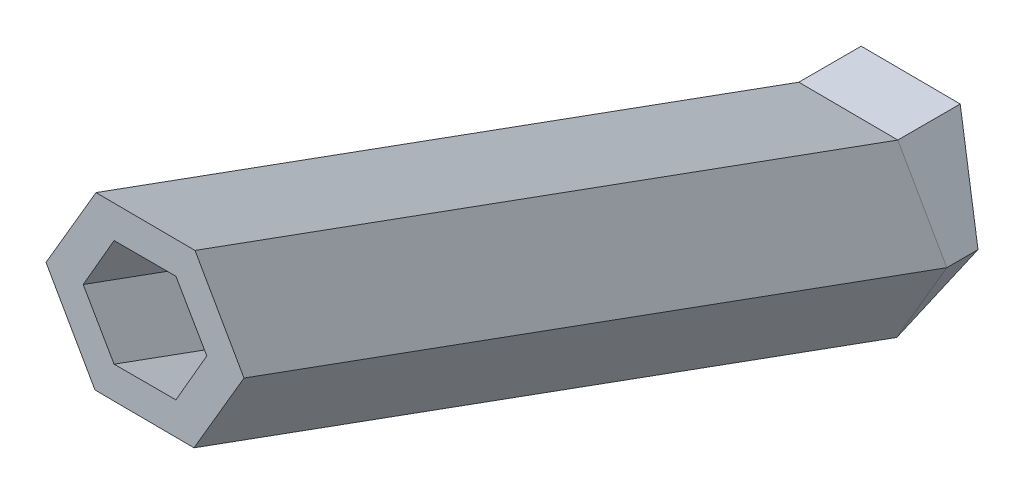
ISO-10303-21;
HEADER;
FILE_DESCRIPTION(('STEP AP214'),'2;1');
FILE_NAME('part.step','',(''),(''),'','','');
FILE_SCHEMA(('AUTOMOTIVE_DESIGN { 1 0 10303 214 1 1 1 1 }'));
ENDSEC;
DATA;
#1=APPLICATION_CONTEXT('core data for automotive mechanical design processes');
#2=APPLICATION_PROTOCOL_DEFINITION('international standard','automotive_design',2000,#1);
#3=PRODUCT_CONTEXT('',#1,'mechanical');
#4=PRODUCT('Part','Part','',(#3));
#5=PRODUCT_RELATED_PRODUCT_CATEGORY('part','',(#4));
#6=PRODUCT_DEFINITION_FORMATION('','',#4);
#7=PRODUCT_DEFINITION_CONTEXT('part definition',#1,'design');
#8=PRODUCT_DEFINITION('design','',#6,#7);
#9=PRODUCT_DEFINITION_SHAPE('','',#8);
#10=(LENGTH_UNIT() NAMED_UNIT(*) SI_UNIT(.MILLI.,.METRE.));
#11=(NAMED_UNIT(*) PLANE_ANGLE_UNIT() SI_UNIT($,.RADIAN.));
#12=(NAMED_UNIT(*) SI_UNIT($,.STERADIAN.) SOLID_ANGLE_UNIT());
#13=UNCERTAINTY_MEASURE_WITH_UNIT(LENGTH_MEASURE(1.E-05),#10,'distance_accuracy_value','');
#14=(GEOMETRIC_REPRESENTATION_CONTEXT(3) GLOBAL_UNCERTAINTY_ASSIGNED_CONTEXT((#13)) GLOBAL_UNIT_ASSIGNED_CONTEXT((#10,
#11,#12)) REPRESENTATION_CONTEXT('',''));
#15=CARTESIAN_POINT('',(0.,0.,0.));
#16=DIRECTION('',(0.,0.,1.));
#17=DIRECTION('',(1.,0.,0.));
#18=AXIS2_PLACEMENT_3D('',#15,#16,#17);
#19=CARTESIAN_POINT('',(0.128355163343738,1.38763360146466E-13,6.20198748145939));
#20=DIRECTION('',(0.,0.,1.));
#21=DIRECTION('',(1.,0.,0.));
#22=AXIS2_PLACEMENT_3D('',#19,#20,#21);
#23=PLANE('',#22);
#24=DIRECTION('',(1.,0.,0.));
#25=VECTOR('',#24,1.);
#26=CARTESIAN_POINT('',(3.64119484408319,-6.08441680588479,6.20198748145939));
#27=LINE('',#26,#25);
#28=CARTESIAN_POINT('',(-3.38448451739586,-6.0844168058847,6.20198748145939));
#29=VERTEX_POINT('',#28);
#30=CARTESIAN_POINT('',(3.64119484408319,-6.08441680588479,6.20198748145939));
#31=VERTEX_POINT('',#30);
#32=EDGE_CURVE('E299',#29,#31,#27,.T.);
#33=ORIENTED_EDGE('',*,*,#32,.T.);
#34=DIRECTION('',(0.500000000000011,0.866025403784432,0.));
#35=VECTOR('',#34,1.);
#36=CARTESIAN_POINT('',(6.99580116644336,-0.274068216165352,6.20198748145939));
#37=LINE('',#36,#35);
#38=CARTESIAN_POINT('',(7.15403452482278,0.,6.20198748145939));
#39=VERTEX_POINT('',#38);
#40=EDGE_CURVE('E294',#31,#39,#37,.T.);
#41=ORIENTED_EDGE('',*,*,#40,.T.);
#42=DIRECTION('',(-0.499999999999989,0.866025403784445,0.));
#43=VECTOR('',#42,1.);
#44=CARTESIAN_POINT('',(3.79942820246275,5.81034858971957,6.20198748145939));
#45=LINE('',#44,#43);
#46=CARTESIAN_POINT('',(3.64119484408333,6.08441680588498,6.20198748145939));
#47=VERTEX_POINT('',#46);
#48=EDGE_CURVE('E288',#39,#47,#45,.T.);
#49=ORIENTED_EDGE('',*,*,#48,.T.);
#50=DIRECTION('',(-1.,0.,0.));
#51=VECTOR('',#50,1.);
#52=CARTESIAN_POINT('',(-3.3844845173957,6.08441680588507,6.20198748145939));
#53=LINE('',#52,#51);
#54=CARTESIAN_POINT('',(-3.38448451739571,6.08441680588506,6.20198748145937));
#55=VERTEX_POINT('',#54);
#56=EDGE_CURVE('E275',#47,#55,#53,.T.);
#57=ORIENTED_EDGE('',*,*,#56,.T.);
#58=DIRECTION('',(-0.500000000000011,-0.866025403784432,0.));
#59=VECTOR('',#58,1.);
#60=CARTESIAN_POINT('',(-7.05555755651473,-0.274068216165179,6.20198748145939));
#61=LINE('',#60,#59);
#62=CARTESIAN_POINT('',(-6.8973241981353,2.25011642967688E-13,6.20198748145939));
#63=VERTEX_POINT('',#62);
#64=EDGE_CURVE('E309',#55,#63,#61,.T.);
#65=ORIENTED_EDGE('',*,*,#64,.T.);
#66=DIRECTION('',(0.499999999999989,-0.866025403784445,0.));
#67=VECTOR('',#66,1.);
#68=CARTESIAN_POINT('',(-3.22625115901644,-6.35848502205012,6.20198748145939));
#69=LINE('',#68,#67);
#70=EDGE_CURVE('E304',#63,#29,#69,.T.);
#71=ORIENTED_EDGE('',*,*,#70,.T.);
#72=EDGE_LOOP('',(#33,#41,#49,#57,#65,#71));
#73=FACE_BOUND('',#72,.T.);
#74=DIRECTION('',(-0.999982083015537,0.00598612127412032,0.));
#75=VECTOR('',#74,1.);
#76=CARTESIAN_POINT('',(5.812623598539,9.71072917481305,6.20198748145939));
#77=LINE('',#76,#75);
#78=CARTESIAN_POINT('',(5.812623598539,9.71072917481305,6.20198748145939));
#79=VERTEX_POINT('',#78);
#80=CARTESIAN_POINT('',(-5.43924877371731,9.77808545421571,6.20198748145939));
#81=VERTEX_POINT('',#80);
#82=EDGE_CURVE('E317',#79,#81,#77,.T.);
#83=ORIENTED_EDGE('',*,*,#82,.F.);
#84=DIRECTION('',(-0.494806908414245,0.869002947857795,0.));
#85=VECTOR('',#84,1.);
#86=CARTESIAN_POINT('',(11.3802275356,-0.0673562794025248,6.20198748145939));
#87=LINE('',#86,#85);
#88=CARTESIAN_POINT('',(11.3802275356,-0.0673562794025248,6.20198748145939));
#89=VERTEX_POINT('',#88);
#90=EDGE_CURVE('E366',#89,#79,#87,.T.);
#91=ORIENTED_EDGE('',*,*,#90,.F.);
#92=DIRECTION('',(0.505175174601291,0.863016826583674,0.));
#93=VECTOR('',#92,1.);
#94=CARTESIAN_POINT('',(5.69595910040478,-9.77808545421543,6.20198748145939));
#95=LINE('',#94,#93);
#96=CARTESIAN_POINT('',(5.69595910040478,-9.77808545421543,6.20198748145939));
#97=VERTEX_POINT('',#96);
#98=EDGE_CURVE('E392',#97,#89,#95,.T.);
#99=ORIENTED_EDGE('',*,*,#98,.F.);
#100=DIRECTION('',(0.999982083015537,-0.00598612127412063,0.));
#101=VECTOR('',#100,1.);
#102=CARTESIAN_POINT('',(-5.55591327185152,-9.71072917481277,6.20198748145939));
#103=LINE('',#102,#101);
#104=CARTESIAN_POINT('',(-5.55591327185152,-9.71072917481277,6.20198748145939));
#105=VERTEX_POINT('',#104);
#106=EDGE_CURVE('E381',#105,#97,#103,.T.);
#107=ORIENTED_EDGE('',*,*,#106,.F.);
#108=DIRECTION('',(0.494806908414245,-0.869002947857794,0.));
#109=VECTOR('',#108,1.);
#110=CARTESIAN_POINT('',(-11.1235172089126,0.0673562794028021,6.20198748145939));
#111=LINE('',#110,#109);
#112=CARTESIAN_POINT('',(-11.1235172089126,0.0673562794028021,6.20198748145939));
#113=VERTEX_POINT('',#112);
#114=EDGE_CURVE('E370',#113,#105,#111,.T.);
#115=ORIENTED_EDGE('',*,*,#114,.F.);
#116=DIRECTION('',(-0.50517517460129,-0.863016826583674,0.));
#117=VECTOR('',#116,1.);
#118=CARTESIAN_POINT('',(-5.43924877371731,9.77808545421571,6.20198748145939));
#119=LINE('',#118,#117);
#120=EDGE_CURVE('E353',#81,#113,#119,.T.);
#121=ORIENTED_EDGE('',*,*,#120,.F.);
#122=EDGE_LOOP('',(#83,#91,#99,#107,#115,#121));
#123=FACE_BOUND('',#122,.T.);
#124=ADVANCED_FACE('F55',(#73,#123),#23,.F.);
#125=CARTESIAN_POINT('',(0.128355163343738,29.0717121826812,86.0758602482619));
#126=DIRECTION('',(0.,0.,1.));
#127=DIRECTION('',(1.,0.,0.));
#128=AXIS2_PLACEMENT_3D('',#125,#126,#127);
#129=PLANE('',#128);
#130=DIRECTION('',(-0.499999999999989,0.866025403784445,0.));
#131=VECTOR('',#130,1.);
#132=CARTESIAN_POINT('',(16.3878488433183,13.0782766353895,86.0758602482619));
#133=LINE('',#132,#131);
#134=CARTESIAN_POINT('',(7.15403452482278,29.0717121826812,86.0758602482619));
#135=VERTEX_POINT('',#134);
#136=CARTESIAN_POINT('',(3.64119484408333,35.1561289885661,86.0758602482619));
#137=VERTEX_POINT('',#136);
#138=EDGE_CURVE('E333',#135,#137,#133,.T.);
#139=ORIENTED_EDGE('',*,*,#138,.F.);
#140=DIRECTION('',(0.500000000000011,0.866025403784432,0.));
#141=VECTOR('',#140,1.);
#142=CARTESIAN_POINT('',(-5.59261947441254,6.99385982950525,86.0758602482619));
#143=LINE('',#142,#141);
#144=CARTESIAN_POINT('',(3.64119484408319,22.9872953767964,86.0758602482619));
#145=VERTEX_POINT('',#144);
#146=EDGE_CURVE('E313',#145,#135,#143,.T.);
#147=ORIENTED_EDGE('',*,*,#146,.F.);
#148=DIRECTION('',(1.,0.,0.));
#149=VECTOR('',#148,1.);
#150=CARTESIAN_POINT('',(3.64119484408355,22.9872953767964,86.0758602482619));
#151=LINE('',#150,#149);
#152=CARTESIAN_POINT('',(-3.38448451739586,22.9872953767964,86.0758602482619));
#153=VERTEX_POINT('',#152);
#154=EDGE_CURVE('E318',#153,#145,#151,.T.);
#155=ORIENTED_EDGE('',*,*,#154,.F.);
#156=DIRECTION('',(0.499999999999989,-0.866025403784445,0.));
#157=VECTOR('',#156,1.);
#158=CARTESIAN_POINT('',(9.36216948183909,0.909443023619861,86.0758602482619));
#159=LINE('',#158,#157);
#160=CARTESIAN_POINT('',(-6.8973241981353,29.0717121826814,86.0758602482619));
#161=VERTEX_POINT('',#160);
#162=EDGE_CURVE('E321',#161,#153,#159,.T.);
#163=ORIENTED_EDGE('',*,*,#162,.F.);
#164=DIRECTION('',(-0.500000000000011,-0.866025403784432,0.));
#165=VECTOR('',#164,1.);
#166=CARTESIAN_POINT('',(-19.6439781973706,6.99385982950542,86.0758602482619));
#167=LINE('',#166,#165);
#168=CARTESIAN_POINT('',(-3.38448451739571,35.1561289885662,86.0758602482619));
#169=VERTEX_POINT('',#168);
#170=EDGE_CURVE('E325',#169,#161,#167,.T.);
#171=ORIENTED_EDGE('',*,*,#170,.F.);
#172=DIRECTION('',(-1.,0.,0.));
#173=VECTOR('',#172,1.);
#174=CARTESIAN_POINT('',(-3.38448451739535,35.1561289885662,86.0758602482619));
#175=LINE('',#174,#173);
#176=EDGE_CURVE('E329',#137,#169,#175,.T.);
#177=ORIENTED_EDGE('',*,*,#176,.F.);
#178=EDGE_LOOP('',(#139,#147,#155,#163,#171,#177));
#179=FACE_BOUND('',#178,.T.);
#180=DIRECTION('',(-0.999982083015537,0.00598612127412032,0.));
#181=VECTOR('',#180,1.);
#182=CARTESIAN_POINT('',(5.812623598539,38.7824413574941,86.0758602482619));
#183=LINE('',#182,#181);
#184=CARTESIAN_POINT('',(5.812623598539,38.7824413574941,86.0758602482619));
#185=VERTEX_POINT('',#184);
#186=CARTESIAN_POINT('',(-5.43924877371731,38.8497976368968,86.0758602482619));
#187=VERTEX_POINT('',#186);
#188=EDGE_CURVE('E354',#185,#187,#183,.T.);
#189=ORIENTED_EDGE('',*,*,#188,.T.);
#190=DIRECTION('',(-0.50517517460129,-0.863016826583674,0.));
#191=VECTOR('',#190,1.);
#192=CARTESIAN_POINT('',(-5.43924877371731,38.8497976368968,86.0758602482619));
#193=LINE('',#192,#191);
#194=CARTESIAN_POINT('',(-11.1235172089126,29.1390684620839,86.0758602482619));
#195=VERTEX_POINT('',#194);
#196=EDGE_CURVE('E362',#187,#195,#193,.T.);
#197=ORIENTED_EDGE('',*,*,#196,.T.);
#198=DIRECTION('',(0.494806908414245,-0.869002947857794,0.));
#199=VECTOR('',#198,1.);
#200=CARTESIAN_POINT('',(-11.1235172089126,29.1390684620839,86.0758602482619));
#201=LINE('',#200,#199);
#202=CARTESIAN_POINT('',(-5.55591327185152,19.3609830078683,86.0758602482619));
#203=VERTEX_POINT('',#202);
#204=EDGE_CURVE('E377',#195,#203,#201,.T.);
#205=ORIENTED_EDGE('',*,*,#204,.T.);
#206=DIRECTION('',(0.999982083015537,-0.00598612127412063,0.));
#207=VECTOR('',#206,1.);
#208=CARTESIAN_POINT('',(-5.55591327185152,19.3609830078683,86.0758602482619));
#209=LINE('',#208,#207);
#210=CARTESIAN_POINT('',(5.69595910040478,19.2936267284657,86.0758602482619));
#211=VERTEX_POINT('',#210);
#212=EDGE_CURVE('E388',#203,#211,#209,.T.);
#213=ORIENTED_EDGE('',*,*,#212,.T.);
#214=DIRECTION('',(0.505175174601291,0.863016826583674,0.));
#215=VECTOR('',#214,1.);
#216=CARTESIAN_POINT('',(5.69595910040478,19.2936267284657,86.0758602482619));
#217=LINE('',#216,#215);
#218=CARTESIAN_POINT('',(11.3802275356,29.0043559032786,86.0758602482619));
#219=VERTEX_POINT('',#218);
#220=EDGE_CURVE('E399',#211,#219,#217,.T.);
#221=ORIENTED_EDGE('',*,*,#220,.T.);
#222=DIRECTION('',(-0.494806908414245,0.869002947857795,0.));
#223=VECTOR('',#222,1.);
#224=CARTESIAN_POINT('',(11.3802275356,29.0043559032786,86.0758602482619));
#225=LINE('',#224,#223);
#226=EDGE_CURVE('E12',#219,#185,#225,.T.);
#227=ORIENTED_EDGE('',*,*,#226,.T.);
#228=EDGE_LOOP('',(#189,#197,#205,#213,#221,#227));
#229=FACE_BOUND('',#228,.T.);
#230=ADVANCED_FACE('F421',(#179,#229),#129,.T.);
#231=CARTESIAN_POINT('',(5.812623598539,9.71072917481305,6.20198748145939));
#232=DIRECTION('',(0.00562512577796662,0.939677753772549,-0.342014732175324));
#233=DIRECTION('',(0.,0.34202014332566,0.939692620785912));
#234=AXIS2_PLACEMENT_3D('',#231,#232,#233);
#235=PLANE('',#234);
#236=DIRECTION('',(0.,0.34202014332566,0.939692620785912));
#237=VECTOR('',#236,1.);
#238=CARTESIAN_POINT('',(-5.43924877371731,9.77808545421571,6.20198748145939));
#239=LINE('',#238,#237);
#240=EDGE_CURVE('E357',#81,#187,#239,.T.);
#241=ORIENTED_EDGE('',*,*,#240,.T.);
#242=ORIENTED_EDGE('',*,*,#188,.F.);
#243=DIRECTION('',(0.,0.34202014332566,0.939692620785912));
#244=VECTOR('',#243,1.);
#245=CARTESIAN_POINT('',(5.812623598539,9.71072917481305,6.20198748145939));
#246=LINE('',#245,#244);
#247=EDGE_CURVE('E358',#79,#185,#246,.T.);
#248=ORIENTED_EDGE('',*,*,#247,.F.);
#249=ORIENTED_EDGE('',*,*,#82,.T.);
#250=EDGE_LOOP('',(#241,#242,#248,#249));
#251=FACE_BOUND('',#250,.T.);
#252=ADVANCED_FACE('F417',(#251),#235,.T.);
#253=CARTESIAN_POINT('',(-5.43924877371731,9.77808545421571,6.20198748145939));
#254=DIRECTION('',(-0.848788291898737,0.496846365391118,-0.180837288005711));
#255=DIRECTION('',(-0.50517517460129,-0.863016826583675,0.));
#256=AXIS2_PLACEMENT_3D('',#253,#254,#255);
#257=PLANE('',#256);
#258=DIRECTION('',(0.,0.34202014332566,0.939692620785912));
#259=VECTOR('',#258,1.);
#260=CARTESIAN_POINT('',(-11.1235172089126,0.0673562794028021,6.20198748145939));
#261=LINE('',#260,#259);
#262=EDGE_CURVE('E373',#113,#195,#261,.T.);
#263=ORIENTED_EDGE('',*,*,#262,.T.);
#264=ORIENTED_EDGE('',*,*,#196,.F.);
#265=ORIENTED_EDGE('',*,*,#240,.F.);
#266=ORIENTED_EDGE('',*,*,#120,.T.);
#267=EDGE_LOOP('',(#263,#264,#265,#266));
#268=FACE_BOUND('',#267,.T.);
#269=ADVANCED_FACE('F424',(#268),#257,.T.);
#270=CARTESIAN_POINT('',(-11.1235172089126,0.0673562794028021,6.20198748145939));
#271=DIRECTION('',(-0.855244042473658,-0.486972641047177,0.177243546243167));
#272=DIRECTION('',(0.494806908414245,-0.869002947857794,0.));
#273=AXIS2_PLACEMENT_3D('',#270,#271,#272);
#274=PLANE('',#273);
#275=DIRECTION('',(0.,0.34202014332566,0.939692620785912));
#276=VECTOR('',#275,1.);
#277=CARTESIAN_POINT('',(-5.55591327185152,-9.71072917481277,6.20198748145939));
#278=LINE('',#277,#276);
#279=EDGE_CURVE('E384',#105,#203,#278,.T.);
#280=ORIENTED_EDGE('',*,*,#279,.T.);
#281=ORIENTED_EDGE('',*,*,#204,.F.);
#282=ORIENTED_EDGE('',*,*,#262,.F.);
#283=ORIENTED_EDGE('',*,*,#114,.T.);
#284=EDGE_LOOP('',(#280,#281,#282,#283));
#285=FACE_BOUND('',#284,.T.);
#286=ADVANCED_FACE('F427',(#285),#274,.T.);
#287=CARTESIAN_POINT('',(-5.55591327185152,-9.71072917481277,6.20198748145939));
#288=DIRECTION('',(-0.00562512577796692,-0.939677753772549,0.342014732175324));
#289=DIRECTION('',(0.,-0.34202014332566,-0.939692620785912));
#290=AXIS2_PLACEMENT_3D('',#287,#288,#289);
#291=PLANE('',#290);
#292=DIRECTION('',(0.,-0.34202014332566,-0.939692620785911));
#293=VECTOR('',#292,1.);
#294=CARTESIAN_POINT('',(-3.67991775642901,-4.59277851637198,20.2942958996383));
#295=LINE('',#294,#293);
#296=CARTESIAN_POINT('',(-3.67991775642901,-2.02762744142953,27.3419905555327));
#297=VERTEX_POINT('',#296);
#298=CARTESIAN_POINT('',(-3.67991775642901,-4.59277851637198,20.2942958996383));
#299=VERTEX_POINT('',#298);
#300=EDGE_CURVE('E70',#297,#299,#295,.T.);
#301=ORIENTED_EDGE('',*,*,#300,.F.);
#302=DIRECTION('',(-0.999984178854837,0.00528588918454823,-0.00192390632480545));
#303=VECTOR('',#302,1.);
#304=CARTESIAN_POINT('',(3.81996358498227,-2.06727161031364,27.3564198529687));
#305=LINE('',#304,#303);
#306=CARTESIAN_POINT('',(3.81996358498227,-2.06727161031364,27.3564198529687));
#307=VERTEX_POINT('',#306);
#308=EDGE_CURVE('E214',#307,#297,#305,.T.);
#309=ORIENTED_EDGE('',*,*,#308,.F.);
#310=DIRECTION('',(0.,0.34202014332566,0.939692620785911));
#311=VECTOR('',#310,1.);
#312=CARTESIAN_POINT('',(3.81996358498227,-4.63242268525609,20.3087251970744));
#313=LINE('',#312,#311);
#314=CARTESIAN_POINT('',(3.81996358498227,-4.63242268525609,20.3087251970744));
#315=VERTEX_POINT('',#314);
#316=EDGE_CURVE('E218',#315,#307,#313,.T.);
#317=ORIENTED_EDGE('',*,*,#316,.F.);
#318=DIRECTION('',(0.999984178854837,-0.00528588918454811,0.00192390632480545));
#319=VECTOR('',#318,1.);
#320=CARTESIAN_POINT('',(3.81996358498227,-4.63242268525609,20.3087251970744));
#321=LINE('',#320,#319);
#322=EDGE_CURVE('E227',#299,#315,#321,.T.);
#323=ORIENTED_EDGE('',*,*,#322,.F.);
#324=EDGE_LOOP('',(#301,#309,#317,#323));
#325=FACE_BOUND('',#324,.T.);
#326=DIRECTION('',(0.,0.34202014332566,0.939692620785912));
#327=VECTOR('',#326,1.);
#328=CARTESIAN_POINT('',(3.81996358498227,14.1753149404144,71.9825596346326));
#329=LINE('',#328,#327);
#330=CARTESIAN_POINT('',(3.81996358498227,11.6101638654719,64.9348649787382));
#331=VERTEX_POINT('',#330);
#332=CARTESIAN_POINT('',(3.81996358498116,14.1753149404144,71.9825596346326));
#333=VERTEX_POINT('',#332);
#334=EDGE_CURVE('E78',#331,#333,#329,.T.);
#335=ORIENTED_EDGE('',*,*,#334,.F.);
#336=DIRECTION('',(0.999984178854837,-0.00528588918454799,0.00192390632480407));
#337=VECTOR('',#336,1.);
#338=CARTESIAN_POINT('',(-3.679917756429,11.649808034356,64.9204356813022));
#339=LINE('',#338,#337);
#340=CARTESIAN_POINT('',(-3.679917756429,11.649808034356,64.9204356813022));
#341=VERTEX_POINT('',#340);
#342=EDGE_CURVE('E246',#341,#331,#339,.T.);
#343=ORIENTED_EDGE('',*,*,#342,.F.);
#344=DIRECTION('',(0.,-0.34202014332566,-0.939692620785912));
#345=VECTOR('',#344,1.);
#346=CARTESIAN_POINT('',(-3.679917756429,14.2149591092985,71.9681303371965));
#347=LINE('',#346,#345);
#348=CARTESIAN_POINT('',(-3.679917756429,14.2149591092985,71.9681303371965));
#349=VERTEX_POINT('',#348);
#350=EDGE_CURVE('E265',#349,#341,#347,.T.);
#351=ORIENTED_EDGE('',*,*,#350,.F.);
#352=DIRECTION('',(-0.999984178854837,0.00528588918454799,-0.00192390632480407));
#353=VECTOR('',#352,1.);
#354=CARTESIAN_POINT('',(-3.679917756429,14.2149591092985,71.9681303371965));
#355=LINE('',#354,#353);
#356=EDGE_CURVE('E261',#333,#349,#355,.T.);
#357=ORIENTED_EDGE('',*,*,#356,.F.);
#358=EDGE_LOOP('',(#335,#343,#351,#357));
#359=FACE_BOUND('',#358,.T.);
#360=DIRECTION('',(0.,0.34202014332566,0.939692620785912));
#361=VECTOR('',#360,1.);
#362=CARTESIAN_POINT('',(5.69595910040478,-9.77808545421543,6.20198748145939));
#363=LINE('',#362,#361);
#364=EDGE_CURVE('E395',#97,#211,#363,.T.);
#365=ORIENTED_EDGE('',*,*,#364,.T.);
#366=ORIENTED_EDGE('',*,*,#212,.F.);
#367=ORIENTED_EDGE('',*,*,#279,.F.);
#368=ORIENTED_EDGE('',*,*,#106,.T.);
#369=EDGE_LOOP('',(#365,#366,#367,#368));
#370=FACE_BOUND('',#369,.T.);
#371=ADVANCED_FACE('F432',(#325,#359,#370),#291,.T.);
#372=CARTESIAN_POINT('',(5.69595910040478,-9.77808545421543,6.20198748145939));
#373=DIRECTION('',(0.848788291898736,-0.496846365391119,0.180837288005711));
#374=DIRECTION('',(0.505175174601291,0.863016826583674,0.));
#375=AXIS2_PLACEMENT_3D('',#372,#373,#374);
#376=PLANE('',#375);
#377=DIRECTION('',(0.,0.34202014332566,0.939692620785912));
#378=VECTOR('',#377,1.);
#379=CARTESIAN_POINT('',(11.3802275356,-0.0673562794025248,6.20198748145939));
#380=LINE('',#379,#378);
#381=EDGE_CURVE('E63',#89,#219,#380,.T.);
#382=ORIENTED_EDGE('',*,*,#381,.T.);
#383=ORIENTED_EDGE('',*,*,#220,.F.);
#384=ORIENTED_EDGE('',*,*,#364,.F.);
#385=ORIENTED_EDGE('',*,*,#98,.T.);
#386=EDGE_LOOP('',(#382,#383,#384,#385));
#387=FACE_BOUND('',#386,.T.);
#388=ADVANCED_FACE('F435',(#387),#376,.T.);
#389=CARTESIAN_POINT('',(11.3802275356,-0.0673562794025248,6.20198748145939));
#390=DIRECTION('',(0.855244042473658,0.486972641047176,-0.177243546243167));
#391=DIRECTION('',(-0.494806908414245,0.869002947857795,0.));
#392=AXIS2_PLACEMENT_3D('',#389,#390,#391);
#393=PLANE('',#392);
#394=ORIENTED_EDGE('',*,*,#226,.F.);
#395=ORIENTED_EDGE('',*,*,#381,.F.);
#396=ORIENTED_EDGE('',*,*,#90,.T.);
#397=ORIENTED_EDGE('',*,*,#247,.T.);
#398=EDGE_LOOP('',(#394,#395,#396,#397));
#399=FACE_BOUND('',#398,.T.);
#400=ADVANCED_FACE('F413',(#399),#393,.T.);
#401=CARTESIAN_POINT('',(-3.38448451739571,5.71899251766452,5.19799250105314));
#402=DIRECTION('',(0.,-0.939692620785911,0.34202014332566));
#403=DIRECTION('',(0.,-0.342020143325661,-0.939692620785912));
#404=AXIS2_PLACEMENT_3D('',#401,#402,#403);
#405=PLANE('',#404);
#406=ORIENTED_EDGE('',*,*,#176,.T.);
#407=DIRECTION('',(0.,0.34202014332566,0.939692620785911));
#408=VECTOR('',#407,1.);
#409=CARTESIAN_POINT('',(-3.38448451739571,5.71899251766452,5.19799250105314));
#410=LINE('',#409,#408);
#411=EDGE_CURVE('E287',#55,#169,#410,.T.);
#412=ORIENTED_EDGE('',*,*,#411,.F.);
#413=ORIENTED_EDGE('',*,*,#56,.F.);
#414=DIRECTION('',(0.,0.34202014332566,0.939692620785911));
#415=VECTOR('',#414,1.);
#416=CARTESIAN_POINT('',(3.64119484408333,5.71899251766444,5.19799250105314));
#417=LINE('',#416,#415);
#418=EDGE_CURVE('E292',#47,#137,#417,.T.);
#419=ORIENTED_EDGE('',*,*,#418,.T.);
#420=EDGE_LOOP('',(#406,#412,#413,#419));
#421=FACE_BOUND('',#420,.T.);
#422=ADVANCED_FACE('F438',(#421),#405,.T.);
#423=CARTESIAN_POINT('',(-6.8973241981353,-0.365424288220318,5.19799250105314));
#424=DIRECTION('',(0.852031291837936,-0.491920495700631,0.1790444180605));
#425=DIRECTION('',(0.500000000000011,0.866025403784432,0.));
#426=AXIS2_PLACEMENT_3D('',#423,#424,#425);
#427=PLANE('',#426);
#428=ORIENTED_EDGE('',*,*,#170,.T.);
#429=DIRECTION('',(0.,0.34202014332566,0.939692620785911));
#430=VECTOR('',#429,1.);
#431=CARTESIAN_POINT('',(-6.8973241981353,-0.365424288220318,5.19799250105314));
#432=LINE('',#431,#430);
#433=EDGE_CURVE('E308',#63,#161,#432,.T.);
#434=ORIENTED_EDGE('',*,*,#433,.F.);
#435=ORIENTED_EDGE('',*,*,#64,.F.);
#436=ORIENTED_EDGE('',*,*,#411,.T.);
#437=EDGE_LOOP('',(#428,#434,#435,#436));
#438=FACE_BOUND('',#437,.T.);
#439=ADVANCED_FACE('F445',(#438),#427,.T.);
#440=CARTESIAN_POINT('',(-3.38448451739586,-6.44984109410525,5.19799250105314));
#441=DIRECTION('',(0.852031291837949,0.491920495700611,-0.179044418060493));
#442=DIRECTION('',(-0.499999999999989,0.866025403784445,0.));
#443=AXIS2_PLACEMENT_3D('',#440,#441,#442);
#444=PLANE('',#443);
#445=ORIENTED_EDGE('',*,*,#162,.T.);
#446=DIRECTION('',(0.,0.34202014332566,0.939692620785911));
#447=VECTOR('',#446,1.);
#448=CARTESIAN_POINT('',(-3.38448451739586,-6.44984109410525,5.19799250105314));
#449=LINE('',#448,#447);
#450=EDGE_CURVE('E303',#29,#153,#449,.T.);
#451=ORIENTED_EDGE('',*,*,#450,.F.);
#452=ORIENTED_EDGE('',*,*,#70,.F.);
#453=ORIENTED_EDGE('',*,*,#433,.T.);
#454=EDGE_LOOP('',(#445,#451,#452,#453));
#455=FACE_BOUND('',#454,.T.);
#456=ADVANCED_FACE('F467',(#455),#444,.T.);
#457=CARTESIAN_POINT('',(3.64119484408319,-6.44984109410533,5.19799250105314));
#458=DIRECTION('',(0.,0.939692620785911,-0.34202014332566));
#459=DIRECTION('',(0.,0.34202014332566,0.939692620785912));
#460=AXIS2_PLACEMENT_3D('',#457,#458,#459);
#461=PLANE('',#460);
#462=ORIENTED_EDGE('',*,*,#154,.T.);
#463=DIRECTION('',(0.,0.34202014332566,0.939692620785911));
#464=VECTOR('',#463,1.);
#465=CARTESIAN_POINT('',(3.64119484408319,-6.44984109410533,5.19799250105314));
#466=LINE('',#465,#464);
#467=EDGE_CURVE('E298',#31,#145,#466,.T.);
#468=ORIENTED_EDGE('',*,*,#467,.F.);
#469=ORIENTED_EDGE('',*,*,#32,.F.);
#470=ORIENTED_EDGE('',*,*,#450,.T.);
#471=EDGE_LOOP('',(#462,#468,#469,#470));
#472=FACE_BOUND('',#471,.T.);
#473=ADVANCED_FACE('F471',(#472),#461,.T.);
#474=CARTESIAN_POINT('',(7.15403452482278,-0.365424288220492,5.19799250105314));
#475=DIRECTION('',(-0.852031291837936,0.491920495700631,-0.1790444180605));
#476=DIRECTION('',(-0.500000000000011,-0.866025403784432,0.));
#477=AXIS2_PLACEMENT_3D('',#474,#475,#476);
#478=PLANE('',#477);
#479=ORIENTED_EDGE('',*,*,#146,.T.);
#480=DIRECTION('',(0.,0.34202014332566,0.939692620785911));
#481=VECTOR('',#480,1.);
#482=CARTESIAN_POINT('',(7.15403452482278,-0.365424288220492,5.19799250105314));
#483=LINE('',#482,#481);
#484=EDGE_CURVE('E293',#39,#135,#483,.T.);
#485=ORIENTED_EDGE('',*,*,#484,.F.);
#486=ORIENTED_EDGE('',*,*,#40,.F.);
#487=ORIENTED_EDGE('',*,*,#467,.T.);
#488=EDGE_LOOP('',(#479,#485,#486,#487));
#489=FACE_BOUND('',#488,.T.);
#490=ADVANCED_FACE('F475',(#489),#478,.T.);
#491=CARTESIAN_POINT('',(3.64119484408333,5.71899251766444,5.19799250105314));
#492=DIRECTION('',(-0.852031291837949,-0.491920495700611,0.179044418060493));
#493=DIRECTION('',(0.499999999999989,-0.866025403784445,0.));
#494=AXIS2_PLACEMENT_3D('',#491,#492,#493);
#495=PLANE('',#494);
#496=ORIENTED_EDGE('',*,*,#138,.T.);
#497=ORIENTED_EDGE('',*,*,#418,.F.);
#498=ORIENTED_EDGE('',*,*,#48,.F.);
#499=ORIENTED_EDGE('',*,*,#484,.T.);
#500=EDGE_LOOP('',(#496,#497,#498,#499));
#501=FACE_BOUND('',#500,.T.);
#502=ADVANCED_FACE('F479',(#501),#495,.T.);
#503=CARTESIAN_POINT('',(3.83402639942719,16.5245093248457,71.1275228041943));
#504=DIRECTION('',(0.999984178854836,-0.00528588918454808,0.00192390632480522));
#505=DIRECTION('',(0.00528589896721144,0.999986029538467,0.));
#506=AXIS2_PLACEMENT_3D('',#503,#504,#505);
#507=PLANE('',#506);
#508=ORIENTED_EDGE('',*,*,#334,.T.);
#509=DIRECTION('',(-0.00562512577796692,-0.939677753772549,0.342014732175324));
#510=VECTOR('',#509,1.);
#511=CARTESIAN_POINT('',(3.83402639942719,16.5245093248457,71.1275228041943));
#512=LINE('',#511,#510);
#513=CARTESIAN_POINT('',(3.83402639942719,16.5245093248457,71.1275228041943));
#514=VERTEX_POINT('',#513);
#515=EDGE_CURVE('E258',#514,#333,#512,.T.);
#516=ORIENTED_EDGE('',*,*,#515,.F.);
#517=DIRECTION('',(0.,0.34202014332566,0.939692620785912));
#518=VECTOR('',#517,1.);
#519=CARTESIAN_POINT('',(3.83402639942719,16.5245093248457,71.1275228041943));
#520=LINE('',#519,#518);
#521=CARTESIAN_POINT('',(3.83402639942719,13.9593582499033,64.0798281482999));
#522=VERTEX_POINT('',#521);
#523=EDGE_CURVE('E241',#522,#514,#520,.T.);
#524=ORIENTED_EDGE('',*,*,#523,.F.);
#525=DIRECTION('',(-0.00562512577796692,-0.939677753772549,0.342014732175324));
#526=VECTOR('',#525,1.);
#527=CARTESIAN_POINT('',(3.83402639942719,13.9593582499033,64.0798281482999));
#528=LINE('',#527,#526);
#529=EDGE_CURVE('E272',#522,#331,#528,.T.);
#530=ORIENTED_EDGE('',*,*,#529,.T.);
#531=EDGE_LOOP('',(#508,#516,#524,#530));
#532=FACE_BOUND('',#531,.T.);
#533=ADVANCED_FACE('F483',(#532),#507,.F.);
#534=CARTESIAN_POINT('',(-3.66585494198409,13.9990024187874,64.0653988508639));
#535=DIRECTION('',(0.,-0.34202014332566,-0.939692620785912));
#536=DIRECTION('',(0.,0.939692620785912,-0.34202014332566));
#537=AXIS2_PLACEMENT_3D('',#534,#535,#536);
#538=PLANE('',#537);
#539=ORIENTED_EDGE('',*,*,#342,.T.);
#540=ORIENTED_EDGE('',*,*,#529,.F.);
#541=DIRECTION('',(0.999984178854837,-0.00528588918454799,0.00192390632480407));
#542=VECTOR('',#541,1.);
#543=CARTESIAN_POINT('',(-3.66585494198409,13.9990024187874,64.0653988508639));
#544=LINE('',#543,#542);
#545=CARTESIAN_POINT('',(-3.66585494198409,13.9990024187874,64.0653988508639));
#546=VERTEX_POINT('',#545);
#547=EDGE_CURVE('E254',#546,#522,#544,.T.);
#548=ORIENTED_EDGE('',*,*,#547,.F.);
#549=DIRECTION('',(-0.00562512577796692,-0.939677753772549,0.342014732175324));
#550=VECTOR('',#549,1.);
#551=CARTESIAN_POINT('',(-3.66585494198409,13.9990024187874,64.0653988508639));
#552=LINE('',#551,#550);
#553=EDGE_CURVE('E276',#546,#341,#552,.T.);
#554=ORIENTED_EDGE('',*,*,#553,.T.);
#555=EDGE_LOOP('',(#539,#540,#548,#554));
#556=FACE_BOUND('',#555,.T.);
#557=ADVANCED_FACE('F487',(#556),#538,.F.);
#558=CARTESIAN_POINT('',(-3.66585494198409,16.5641534937299,71.1130935067582));
#559=DIRECTION('',(-0.999984178854836,0.00528588918454808,-0.00192390632480522));
#560=DIRECTION('',(-0.00528589896721144,-0.999986029538467,0.));
#561=AXIS2_PLACEMENT_3D('',#558,#559,#560);
#562=PLANE('',#561);
#563=ORIENTED_EDGE('',*,*,#350,.T.);
#564=ORIENTED_EDGE('',*,*,#553,.F.);
#565=DIRECTION('',(0.,-0.34202014332566,-0.939692620785912));
#566=VECTOR('',#565,1.);
#567=CARTESIAN_POINT('',(-3.66585494198409,16.5641534937299,71.1130935067582));
#568=LINE('',#567,#566);
#569=CARTESIAN_POINT('',(-3.66585494198409,16.5641534937299,71.1130935067582));
#570=VERTEX_POINT('',#569);
#571=EDGE_CURVE('E250',#570,#546,#568,.T.);
#572=ORIENTED_EDGE('',*,*,#571,.F.);
#573=DIRECTION('',(-0.00562512577796692,-0.939677753772549,0.342014732175324));
#574=VECTOR('',#573,1.);
#575=CARTESIAN_POINT('',(-3.66585494198409,16.5641534937299,71.1130935067582));
#576=LINE('',#575,#574);
#577=EDGE_CURVE('E279',#570,#349,#576,.T.);
#578=ORIENTED_EDGE('',*,*,#577,.T.);
#579=EDGE_LOOP('',(#563,#564,#572,#578));
#580=FACE_BOUND('',#579,.T.);
#581=ADVANCED_FACE('F492',(#580),#562,.F.);
#582=CARTESIAN_POINT('',(-3.66585494198409,16.5641534937299,71.1130935067582));
#583=DIRECTION('',(0.,0.34202014332566,0.939692620785912));
#584=DIRECTION('',(0.,-0.939692620785912,0.34202014332566));
#585=AXIS2_PLACEMENT_3D('',#582,#583,#584);
#586=PLANE('',#585);
#587=ORIENTED_EDGE('',*,*,#356,.T.);
#588=ORIENTED_EDGE('',*,*,#577,.F.);
#589=DIRECTION('',(-0.999984178854837,0.00528588918454799,-0.00192390632480407));
#590=VECTOR('',#589,1.);
#591=CARTESIAN_POINT('',(-3.66585494198409,16.5641534937299,71.1130935067582));
#592=LINE('',#591,#590);
#593=EDGE_CURVE('E245',#514,#570,#592,.T.);
#594=ORIENTED_EDGE('',*,*,#593,.F.);
#595=ORIENTED_EDGE('',*,*,#515,.T.);
#596=EDGE_LOOP('',(#587,#588,#594,#595));
#597=FACE_BOUND('',#596,.T.);
#598=ADVANCED_FACE('F488',(#597),#586,.F.);
#599=CARTESIAN_POINT('',(-0.0493738663709152,-8.24790870067645,3.00199326199136));
#600=DIRECTION('',(-0.00562512577796644,-0.939677753772549,0.342014732175323));
#601=DIRECTION('',(0.,-0.34202014332566,-0.939692620785912));
#602=AXIS2_PLACEMENT_3D('',#599,#600,#601);
#603=PLANE('',#602);
#604=ORIENTED_EDGE('',*,*,#523,.T.);
#605=ORIENTED_EDGE('',*,*,#593,.T.);
#606=ORIENTED_EDGE('',*,*,#571,.T.);
#607=ORIENTED_EDGE('',*,*,#547,.T.);
#608=EDGE_LOOP('',(#604,#605,#606,#607));
#609=FACE_BOUND('',#608,.T.);
#610=ADVANCED_FACE('F491',(#609),#603,.T.);
#611=CARTESIAN_POINT('',(-3.66585494198409,-2.24358413194061,19.4392590692));
#612=DIRECTION('',(-0.999984178854837,0.00528588918454812,-0.00192390632480511));
#613=DIRECTION('',(-0.00528589896721148,-0.999986029538467,0.));
#614=AXIS2_PLACEMENT_3D('',#611,#612,#613);
#615=PLANE('',#614);
#616=ORIENTED_EDGE('',*,*,#300,.T.);
#617=DIRECTION('',(-0.00562512577796692,-0.939677753772549,0.342014732175324));
#618=VECTOR('',#617,1.);
#619=CARTESIAN_POINT('',(-3.66585494198409,-2.24358413194061,19.4392590692));
#620=LINE('',#619,#618);
#621=CARTESIAN_POINT('',(-3.66585494198409,-2.24358413194061,19.4392590692));
#622=VERTEX_POINT('',#621);
#623=EDGE_CURVE('E189',#622,#299,#620,.T.);
#624=ORIENTED_EDGE('',*,*,#623,.F.);
#625=DIRECTION('',(0.,-0.34202014332566,-0.939692620785911));
#626=VECTOR('',#625,1.);
#627=CARTESIAN_POINT('',(-3.66585494198409,-2.24358413194061,19.4392590692));
#628=LINE('',#627,#626);
#629=CARTESIAN_POINT('',(-3.66585494198409,0.321566943001845,26.4869537250944));
#630=VERTEX_POINT('',#629);
#631=EDGE_CURVE('E193',#630,#622,#628,.T.);
#632=ORIENTED_EDGE('',*,*,#631,.F.);
#633=DIRECTION('',(-0.00562512577796692,-0.939677753772549,0.342014732175324));
#634=VECTOR('',#633,1.);
#635=CARTESIAN_POINT('',(-3.66585494198409,0.321566943001845,26.4869537250944));
#636=LINE('',#635,#634);
#637=EDGE_CURVE('E233',#630,#297,#636,.T.);
#638=ORIENTED_EDGE('',*,*,#637,.T.);
#639=EDGE_LOOP('',(#616,#624,#632,#638));
#640=FACE_BOUND('',#639,.T.);
#641=ADVANCED_FACE('F191',(#640),#615,.F.);
#642=CARTESIAN_POINT('',(3.83402639942718,0.281922774117733,26.5013830225304));
#643=DIRECTION('',(0.,0.34202014332566,0.939692620785912));
#644=DIRECTION('',(0.,-0.939692620785912,0.34202014332566));
#645=AXIS2_PLACEMENT_3D('',#642,#643,#644);
#646=PLANE('',#645);
#647=ORIENTED_EDGE('',*,*,#308,.T.);
#648=ORIENTED_EDGE('',*,*,#637,.F.);
#649=DIRECTION('',(-0.999984178854837,0.00528588918454823,-0.00192390632480545));
#650=VECTOR('',#649,1.);
#651=CARTESIAN_POINT('',(3.83402639942718,0.281922774117733,26.5013830225304));
#652=LINE('',#651,#650);
#653=CARTESIAN_POINT('',(3.83402639942718,0.281922774117733,26.5013830225304));
#654=VERTEX_POINT('',#653);
#655=EDGE_CURVE('E200',#654,#630,#652,.T.);
#656=ORIENTED_EDGE('',*,*,#655,.F.);
#657=DIRECTION('',(-0.00562512577796692,-0.939677753772549,0.342014732175324));
#658=VECTOR('',#657,1.);
#659=CARTESIAN_POINT('',(3.83402639942718,0.281922774117733,26.5013830225304));
#660=LINE('',#659,#658);
#661=EDGE_CURVE('E236',#654,#307,#660,.T.);
#662=ORIENTED_EDGE('',*,*,#661,.T.);
#663=EDGE_LOOP('',(#647,#648,#656,#662));
#664=FACE_BOUND('',#663,.T.);
#665=ADVANCED_FACE('F505',(#664),#646,.F.);
#666=CARTESIAN_POINT('',(3.83402639942718,-2.28322830082472,19.4536883666361));
#667=DIRECTION('',(0.999984178854837,-0.00528588918454812,0.00192390632480511));
#668=DIRECTION('',(0.00528589896721148,0.999986029538467,0.));
#669=AXIS2_PLACEMENT_3D('',#666,#667,#668);
#670=PLANE('',#669);
#671=ORIENTED_EDGE('',*,*,#316,.T.);
#672=ORIENTED_EDGE('',*,*,#661,.F.);
#673=DIRECTION('',(0.,0.34202014332566,0.939692620785911));
#674=VECTOR('',#673,1.);
#675=CARTESIAN_POINT('',(3.83402639942718,-2.28322830082472,19.4536883666361));
#676=LINE('',#675,#674);
#677=CARTESIAN_POINT('',(3.83402639942718,-2.28322830082472,19.4536883666361));
#678=VERTEX_POINT('',#677);
#679=EDGE_CURVE('E209',#678,#654,#676,.T.);
#680=ORIENTED_EDGE('',*,*,#679,.F.);
#681=DIRECTION('',(-0.00562512577796692,-0.939677753772549,0.342014732175324));
#682=VECTOR('',#681,1.);
#683=CARTESIAN_POINT('',(3.83402639942718,-2.28322830082472,19.4536883666361));
#684=LINE('',#683,#682);
#685=EDGE_CURVE('E199',#678,#315,#684,.T.);
#686=ORIENTED_EDGE('',*,*,#685,.T.);
#687=EDGE_LOOP('',(#671,#672,#680,#686));
#688=FACE_BOUND('',#687,.T.);
#689=ADVANCED_FACE('F508',(#688),#670,.F.);
#690=CARTESIAN_POINT('',(3.83402639942718,-2.28322830082472,19.4536883666361));
#691=DIRECTION('',(0.,-0.34202014332566,-0.939692620785912));
#692=DIRECTION('',(0.,0.939692620785912,-0.34202014332566));
#693=AXIS2_PLACEMENT_3D('',#690,#691,#692);
#694=PLANE('',#693);
#695=ORIENTED_EDGE('',*,*,#322,.T.);
#696=ORIENTED_EDGE('',*,*,#685,.F.);
#697=DIRECTION('',(0.999984178854837,-0.00528588918454811,0.00192390632480545));
#698=VECTOR('',#697,1.);
#699=CARTESIAN_POINT('',(3.83402639942718,-2.28322830082472,19.4536883666361));
#700=LINE('',#699,#698);
#701=EDGE_CURVE('E203',#622,#678,#700,.T.);
#702=ORIENTED_EDGE('',*,*,#701,.F.);
#703=ORIENTED_EDGE('',*,*,#623,.T.);
#704=EDGE_LOOP('',(#695,#696,#702,#703));
#705=FACE_BOUND('',#704,.T.);
#706=ADVANCED_FACE('F204',(#705),#694,.F.);
#707=CARTESIAN_POINT('',(-0.0493738663709232,-8.24790870067647,3.00199326199138));
#708=DIRECTION('',(-0.00562512577796713,-0.939677753772549,0.342014732175324));
#709=DIRECTION('',(0.,-0.34202014332566,-0.939692620785911));
#710=AXIS2_PLACEMENT_3D('',#707,#708,#709);
#711=PLANE('',#710);
#712=ORIENTED_EDGE('',*,*,#631,.T.);
#713=ORIENTED_EDGE('',*,*,#701,.T.);
#714=ORIENTED_EDGE('',*,*,#679,.T.);
#715=ORIENTED_EDGE('',*,*,#655,.T.);
#716=EDGE_LOOP('',(#712,#713,#714,#715));
#717=FACE_BOUND('',#716,.T.);
#718=ADVANCED_FACE('F211',(#717),#711,.T.);
#719=CLOSED_SHELL('',(#124,#230,#252,#269,#286,#371,#388,#400,#422,#439,#456,#473,#490,#502,
#533,#557,#581,#598,#610,#641,#665,#689,#706,#718));
#720=MANIFOLD_SOLID_BREP('B2',#719);
#721=CARTESIAN_POINT('',(3.64119484408319,-6.08441680588479,-28.1152363360501));
#722=DIRECTION('',(0.,1.,0.));
#723=DIRECTION('',(-1.,0.,0.));
#724=AXIS2_PLACEMENT_3D('',#721,#722,#723);
#725=PLANE('',#724);
#726=DIRECTION('',(0.999997626489176,0.,-0.00217876479115009));
#727=VECTOR('',#726,1.);
#728=CARTESIAN_POINT('',(3.71304453936352,-6.08441680588479,4.86194644024164));
#729=LINE('',#728,#727);
#730=CARTESIAN_POINT('',(-3.38448451739586,-6.0844168058847,4.87741032335837));
#731=VERTEX_POINT('',#730);
#732=CARTESIAN_POINT('',(3.64119484408319,-6.08441680588479,4.86210298419953));
#733=VERTEX_POINT('',#732);
#734=EDGE_CURVE('E683',#731,#733,#729,.T.);
#735=ORIENTED_EDGE('',*,*,#734,.F.);
#736=DIRECTION('',(0.,0.,1.));
#737=VECTOR('',#736,1.);
#738=CARTESIAN_POINT('',(-3.38448451739586,-6.0844168058847,-28.1152363360501));
#739=LINE('',#738,#737);
#740=CARTESIAN_POINT('',(-3.38448451739586,-6.0844168058847,6.20198748145939));
#741=VERTEX_POINT('',#740);
#742=EDGE_CURVE('E799',#731,#741,#739,.T.);
#743=ORIENTED_EDGE('',*,*,#742,.T.);
#744=DIRECTION('',(-1.,0.,0.));
#745=VECTOR('',#744,1.);
#746=CARTESIAN_POINT('',(3.64119484408319,-6.08441680588479,6.20198748145939));
#747=LINE('',#746,#745);
#748=CARTESIAN_POINT('',(3.64119484408319,-6.08441680588479,6.20198748145939));
#749=VERTEX_POINT('',#748);
#750=EDGE_CURVE('E788',#749,#741,#747,.T.);
#751=ORIENTED_EDGE('',*,*,#750,.F.);
#752=DIRECTION('',(0.,0.,1.));
#753=VECTOR('',#752,1.);
#754=CARTESIAN_POINT('',(3.64119484408319,-6.08441680588479,-28.1152363360501));
#755=LINE('',#754,#753);
#756=EDGE_CURVE('E801',#733,#749,#755,.T.);
#757=ORIENTED_EDGE('',*,*,#756,.F.);
#758=EDGE_LOOP('',(#735,#743,#751,#757));
#759=FACE_BOUND('',#758,.T.);
#760=ADVANCED_FACE('F679',(#759),#725,.T.);
#761=CARTESIAN_POINT('',(7.15403452482278,0.,-28.1152363360501));
#762=DIRECTION('',(-0.866025403784433,0.500000000000011,0.));
#763=DIRECTION('',(-0.500000000000011,-0.866025403784432,0.));
#764=AXIS2_PLACEMENT_3D('',#761,#762,#763);
#765=PLANE('',#764);
#766=DIRECTION('',(0.47672259943023,0.825707763329441,-0.301566332288565));
#767=VECTOR('',#766,1.);
#768=CARTESIAN_POINT('',(11.5755062246895,7.65821362839686,-0.157002854593496));
#769=LINE('',#768,#767);
#770=CARTESIAN_POINT('',(7.15403452482278,0.,2.63994238240617));
#771=VERTEX_POINT('',#770);
#772=EDGE_CURVE('E831',#733,#771,#769,.T.);
#773=ORIENTED_EDGE('',*,*,#772,.F.);
#774=ORIENTED_EDGE('',*,*,#756,.T.);
#775=DIRECTION('',(-0.500000000000011,-0.866025403784432,0.));
#776=VECTOR('',#775,1.);
#777=CARTESIAN_POINT('',(7.15403452482278,0.,6.20198748145939));
#778=LINE('',#777,#776);
#779=CARTESIAN_POINT('',(7.15403452482278,0.,6.20198748145939));
#780=VERTEX_POINT('',#779);
#781=EDGE_CURVE('E796',#780,#749,#778,.T.);
#782=ORIENTED_EDGE('',*,*,#781,.F.);
#783=DIRECTION('',(0.,0.,1.));
#784=VECTOR('',#783,1.);
#785=CARTESIAN_POINT('',(7.15403452482278,0.,-28.1152363360501));
#786=LINE('',#785,#784);
#787=EDGE_CURVE('E803',#771,#780,#786,.T.);
#788=ORIENTED_EDGE('',*,*,#787,.F.);
#789=EDGE_LOOP('',(#773,#774,#782,#788));
#790=FACE_BOUND('',#789,.T.);
#791=ADVANCED_FACE('F876',(#790),#765,.T.);
#792=CARTESIAN_POINT('',(3.64119484408333,6.08441680588498,-28.1152363360501));
#793=DIRECTION('',(-0.866025403784445,-0.499999999999989,0.));
#794=DIRECTION('',(0.49999999999999,-0.866025403784445,0.));
#795=AXIS2_PLACEMENT_3D('',#792,#793,#794);
#796=PLANE('',#795);
#797=DIRECTION('',(-0.47702049513201,0.826223733820326,-0.299676140017872));
#798=VECTOR('',#797,1.);
#799=CARTESIAN_POINT('',(-0.439835689761387,13.1529690377442,-2.1307157694485));
#800=LINE('',#799,#798);
#801=CARTESIAN_POINT('',(3.64119484408333,6.08441680588498,0.433089119771647));
#802=VERTEX_POINT('',#801);
#803=EDGE_CURVE('E835',#771,#802,#800,.T.);
#804=ORIENTED_EDGE('',*,*,#803,.F.);
#805=ORIENTED_EDGE('',*,*,#787,.T.);
#806=DIRECTION('',(0.499999999999989,-0.866025403784445,0.));
#807=VECTOR('',#806,1.);
#808=CARTESIAN_POINT('',(3.64119484408333,6.08441680588498,6.20198748145939));
#809=LINE('',#808,#807);
#810=CARTESIAN_POINT('',(3.64119484408333,6.08441680588498,6.20198748145939));
#811=VERTEX_POINT('',#810);
#812=EDGE_CURVE('E793',#811,#780,#809,.T.);
#813=ORIENTED_EDGE('',*,*,#812,.F.);
#814=DIRECTION('',(0.,0.,1.));
#815=VECTOR('',#814,1.);
#816=CARTESIAN_POINT('',(3.64119484408333,6.08441680588498,-28.1152363360501));
#817=LINE('',#816,#815);
#818=EDGE_CURVE('E805',#802,#811,#817,.T.);
#819=ORIENTED_EDGE('',*,*,#818,.F.);
#820=EDGE_LOOP('',(#804,#805,#813,#819));
#821=FACE_BOUND('',#820,.T.);
#822=ADVANCED_FACE('F883',(#821),#796,.T.);
#823=CARTESIAN_POINT('',(-3.38448451739571,6.08441680588506,-28.1152363360501));
#824=DIRECTION('',(0.,-1.,0.));
#825=DIRECTION('',(1.,0.,0.));
#826=AXIS2_PLACEMENT_3D('',#823,#824,#825);
#827=PLANE('',#826);
#828=DIRECTION('',(-0.999997626489176,0.,0.00217876479115041));
#829=VECTOR('',#828,1.);
#830=CARTESIAN_POINT('',(-3.32225122766639,6.08441680588506,0.448260866908155));
#831=LINE('',#830,#829);
#832=CARTESIAN_POINT('',(-3.38448451739571,6.08441680588506,0.448396458930484));
#833=VERTEX_POINT('',#832);
#834=EDGE_CURVE('E840',#802,#833,#831,.T.);
#835=ORIENTED_EDGE('',*,*,#834,.F.);
#836=ORIENTED_EDGE('',*,*,#818,.T.);
#837=DIRECTION('',(1.,0.,0.));
#838=VECTOR('',#837,1.);
#839=CARTESIAN_POINT('',(-3.38448451739571,6.08441680588506,6.20198748145939));
#840=LINE('',#839,#838);
#841=CARTESIAN_POINT('',(-3.38448451739571,6.08441680588506,6.20198748145939));
#842=VERTEX_POINT('',#841);
#843=EDGE_CURVE('E783',#842,#811,#840,.T.);
#844=ORIENTED_EDGE('',*,*,#843,.F.);
#845=DIRECTION('',(0.,0.,1.));
#846=VECTOR('',#845,1.);
#847=CARTESIAN_POINT('',(-3.38448451739571,6.08441680588506,-28.1152363360501));
#848=LINE('',#847,#846);
#849=EDGE_CURVE('E774',#833,#842,#848,.T.);
#850=ORIENTED_EDGE('',*,*,#849,.F.);
#851=EDGE_LOOP('',(#835,#836,#844,#850));
#852=FACE_BOUND('',#851,.T.);
#853=ADVANCED_FACE('F890',(#852),#827,.T.);
#854=CARTESIAN_POINT('',(-6.8973241981353,2.25011642967688E-13,-28.1152363360501));
#855=DIRECTION('',(0.866025403784432,-0.500000000000011,0.));
#856=DIRECTION('',(0.500000000000011,0.866025403784432,0.));
#857=AXIS2_PLACEMENT_3D('',#854,#855,#856);
#858=PLANE('',#857);
#859=DIRECTION('',(-0.47672259943023,-0.82570776332944,0.301566332288565));
#860=VECTOR('',#859,1.);
#861=CARTESIAN_POINT('',(-2.47145122539613,7.66583685663016,-0.129172344089865));
#862=LINE('',#861,#860);
#863=CARTESIAN_POINT('',(-6.89732419813531,2.24646690138997E-13,2.67055706072384));
#864=VERTEX_POINT('',#863);
#865=EDGE_CURVE('E844',#833,#864,#862,.T.);
#866=ORIENTED_EDGE('',*,*,#865,.F.);
#867=ORIENTED_EDGE('',*,*,#849,.T.);
#868=DIRECTION('',(0.500000000000011,0.866025403784432,0.));
#869=VECTOR('',#868,1.);
#870=CARTESIAN_POINT('',(-6.8973241981353,2.25011642967688E-13,6.20198748145939));
#871=LINE('',#870,#869);
#872=CARTESIAN_POINT('',(-6.8973241981353,2.25011642967688E-13,6.20198748145939));
#873=VERTEX_POINT('',#872);
#874=EDGE_CURVE('E777',#873,#842,#871,.T.);
#875=ORIENTED_EDGE('',*,*,#874,.F.);
#876=DIRECTION('',(0.,0.,1.));
#877=VECTOR('',#876,1.);
#878=CARTESIAN_POINT('',(-6.8973241981353,2.25011642967688E-13,-28.1152363360501));
#879=LINE('',#878,#877);
#880=EDGE_CURVE('E763',#864,#873,#879,.T.);
#881=ORIENTED_EDGE('',*,*,#880,.F.);
#882=EDGE_LOOP('',(#866,#867,#875,#881));
#883=FACE_BOUND('',#882,.T.);
#884=ADVANCED_FACE('F778',(#883),#858,.T.);
#885=CARTESIAN_POINT('',(-3.38448451739586,-6.0844168058847,-28.1152363360501));
#886=DIRECTION('',(0.866025403784445,0.499999999999989,0.));
#887=DIRECTION('',(-0.499999999999989,0.866025403784445,0.));
#888=AXIS2_PLACEMENT_3D('',#885,#886,#887);
#889=PLANE('',#888);
#890=DIRECTION('',(0.477020495132009,-0.826223733820326,0.299676140017872));
#891=VECTOR('',#890,1.);
#892=CARTESIAN_POINT('',(-8.10083814793563,2.08454730867235,1.91447966234284));
#893=LINE('',#892,#891);
#894=EDGE_CURVE('E770',#864,#731,#893,.T.);
#895=ORIENTED_EDGE('',*,*,#894,.F.);
#896=ORIENTED_EDGE('',*,*,#880,.T.);
#897=DIRECTION('',(-0.499999999999989,0.866025403784445,0.));
#898=VECTOR('',#897,1.);
#899=CARTESIAN_POINT('',(-3.38448451739586,-6.0844168058847,6.20198748145939));
#900=LINE('',#899,#898);
#901=EDGE_CURVE('E768',#741,#873,#900,.T.);
#902=ORIENTED_EDGE('',*,*,#901,.F.);
#903=ORIENTED_EDGE('',*,*,#742,.F.);
#904=EDGE_LOOP('',(#895,#896,#902,#903));
#905=FACE_BOUND('',#904,.T.);
#906=ADVANCED_FACE('F765',(#905),#889,.T.);
#907=CARTESIAN_POINT('',(-5.55591327185152,-9.71072917481277,-28.1152363360501));
#908=DIRECTION('',(0.869002947857794,0.494806908414245,0.));
#909=DIRECTION('',(-0.494806908414245,0.869002947857794,0.));
#910=AXIS2_PLACEMENT_3D('',#907,#908,#909);
#911=PLANE('',#910);
#912=DIRECTION('',(0.,0.,1.));
#913=VECTOR('',#912,1.);
#914=CARTESIAN_POINT('',(-11.1235172089126,0.0673562794028021,-28.1152363360501));
#915=LINE('',#914,#913);
#916=CARTESIAN_POINT('',(-11.1235172089126,0.0673562794028021,2.65524972156502));
#917=VERTEX_POINT('',#916);
#918=CARTESIAN_POINT('',(-11.1235172089126,0.0673562794028021,6.20198748145939));
#919=VERTEX_POINT('',#918);
#920=EDGE_CURVE('E825',#917,#919,#915,.T.);
#921=ORIENTED_EDGE('',*,*,#920,.F.);
#922=DIRECTION('',(0.471918093543578,-0.82880454468811,0.300626578483223));
#923=VECTOR('',#922,1.);
#924=CARTESIAN_POINT('',(-10.4245363114342,-1.16022654144267,3.10052240449225));
#925=LINE('',#924,#923);
#926=CARTESIAN_POINT('',(-5.55591327185152,-9.71072917481277,6.20198748145939));
#927=VERTEX_POINT('',#926);
#928=EDGE_CURVE('E847',#917,#927,#925,.T.);
#929=ORIENTED_EDGE('',*,*,#928,.T.);
#930=DIRECTION('',(-0.494806908414245,0.869002947857794,0.));
#931=VECTOR('',#930,1.);
#932=CARTESIAN_POINT('',(-5.55591327185152,-9.71072917481277,6.20198748145939));
#933=LINE('',#932,#931);
#934=EDGE_CURVE('E819',#927,#919,#933,.T.);
#935=ORIENTED_EDGE('',*,*,#934,.T.);
#936=EDGE_LOOP('',(#921,#929,#935));
#937=FACE_BOUND('',#936,.T.);
#938=ADVANCED_FACE('F866',(#937),#911,.F.);
#939=CARTESIAN_POINT('',(0.,0.,6.20198748145939));
#940=DIRECTION('',(0.,0.,-1.));
#941=DIRECTION('',(-1.,0.,0.));
#942=AXIS2_PLACEMENT_3D('',#939,#940,#941);
#943=PLANE('',#942);
#944=DIRECTION('',(0.50517517460129,0.863016826583674,0.));
#945=VECTOR('',#944,1.);
#946=CARTESIAN_POINT('',(-11.1235172089126,0.0673562794028021,6.20198748145939));
#947=LINE('',#946,#945);
#948=CARTESIAN_POINT('',(-5.43924877371731,9.77808545421571,6.20198748145939));
#949=VERTEX_POINT('',#948);
#950=EDGE_CURVE('E773',#919,#949,#947,.T.);
#951=ORIENTED_EDGE('',*,*,#950,.F.);
#952=ORIENTED_EDGE('',*,*,#934,.F.);
#953=DIRECTION('',(-0.999982083015537,0.00598612127412063,0.));
#954=VECTOR('',#953,1.);
#955=CARTESIAN_POINT('',(5.69595910040478,-9.77808545421543,6.20198748145939));
#956=LINE('',#955,#954);
#957=CARTESIAN_POINT('',(5.69595910040478,-9.77808545421543,6.20198748145939));
#958=VERTEX_POINT('',#957);
#959=EDGE_CURVE('E820',#958,#927,#956,.T.);
#960=ORIENTED_EDGE('',*,*,#959,.F.);
#961=DIRECTION('',(-0.505175174601291,-0.863016826583674,0.));
#962=VECTOR('',#961,1.);
#963=CARTESIAN_POINT('',(11.3802275356,-0.0673562794025248,6.20198748145939));
#964=LINE('',#963,#962);
#965=CARTESIAN_POINT('',(11.3802275356,-0.0673562794025248,6.20198748145939));
#966=VERTEX_POINT('',#965);
#967=EDGE_CURVE('E816',#966,#958,#964,.T.);
#968=ORIENTED_EDGE('',*,*,#967,.F.);
#969=DIRECTION('',(0.494806908414245,-0.869002947857795,0.));
#970=VECTOR('',#969,1.);
#971=CARTESIAN_POINT('',(5.812623598539,9.71072917481305,6.20198748145939));
#972=LINE('',#971,#970);
#973=CARTESIAN_POINT('',(5.812623598539,9.71072917481305,6.20198748145939));
#974=VERTEX_POINT('',#973);
#975=EDGE_CURVE('E813',#974,#966,#972,.T.);
#976=ORIENTED_EDGE('',*,*,#975,.F.);
#977=DIRECTION('',(0.999982083015537,-0.00598612127412032,0.));
#978=VECTOR('',#977,1.);
#979=CARTESIAN_POINT('',(-5.43924877371731,9.77808545421571,6.20198748145939));
#980=LINE('',#979,#978);
#981=EDGE_CURVE('E810',#949,#974,#980,.T.);
#982=ORIENTED_EDGE('',*,*,#981,.F.);
#983=EDGE_LOOP('',(#951,#952,#960,#968,#976,#982));
#984=FACE_BOUND('',#983,.T.);
#985=ORIENTED_EDGE('',*,*,#901,.T.);
#986=ORIENTED_EDGE('',*,*,#874,.T.);
#987=ORIENTED_EDGE('',*,*,#843,.T.);
#988=ORIENTED_EDGE('',*,*,#812,.T.);
#989=ORIENTED_EDGE('',*,*,#781,.T.);
#990=ORIENTED_EDGE('',*,*,#750,.T.);
#991=EDGE_LOOP('',(#985,#986,#987,#988,#989,#990));
#992=FACE_BOUND('',#991,.T.);
#993=ADVANCED_FACE('F785',(#984,#992),#943,.F.);
#994=CARTESIAN_POINT('',(11.3802275356,-0.0673562794025248,-28.1152363360501));
#995=DIRECTION('',(-0.863016826583674,0.505175174601291,0.));
#996=DIRECTION('',(-0.505175174601291,-0.863016826583674,0.));
#997=AXIS2_PLACEMENT_3D('',#994,#995,#996);
#998=PLANE('',#997);
#999=ORIENTED_EDGE('',*,*,#967,.T.);
#1000=DIRECTION('',(0.481806743700109,0.823095329858315,-0.300626578483224));
#1001=VECTOR('',#1000,1.);
#1002=CARTESIAN_POINT('',(15.8371451364416,7.54662611246573,-0.125674178820742));
#1003=LINE('',#1002,#1001);
#1004=CARTESIAN_POINT('',(11.3802275356,-0.0673562794025256,2.65524972156499));
#1005=VERTEX_POINT('',#1004);
#1006=EDGE_CURVE('E822',#958,#1005,#1003,.T.);
#1007=ORIENTED_EDGE('',*,*,#1006,.T.);
#1008=DIRECTION('',(0.,0.,1.));
#1009=VECTOR('',#1008,1.);
#1010=CARTESIAN_POINT('',(11.3802275356,-0.0673562794025248,-28.1152363360501));
#1011=LINE('',#1010,#1009);
#1012=EDGE_CURVE('E827',#1005,#966,#1011,.T.);
#1013=ORIENTED_EDGE('',*,*,#1012,.T.);
#1014=EDGE_LOOP('',(#999,#1007,#1013));
#1015=FACE_BOUND('',#1014,.T.);
#1016=ADVANCED_FACE('F858',(#1015),#998,.F.);
#1017=CARTESIAN_POINT('',(5.812623598539,9.71072917481305,-28.1152363360501));
#1018=DIRECTION('',(-0.869002947857795,-0.494806908414245,0.));
#1019=DIRECTION('',(0.494806908414245,-0.869002947857795,0.));
#1020=AXIS2_PLACEMENT_3D('',#1017,#1018,#1019);
#1021=PLANE('',#1020);
#1022=ORIENTED_EDGE('',*,*,#1012,.F.);
#1023=DIRECTION('',(-0.471918093543578,0.82880454468811,-0.300626578483223));
#1024=VECTOR('',#1023,1.);
#1025=CARTESIAN_POINT('',(1.95035988831264,16.4938166631167,-3.35187076213368));
#1026=LINE('',#1025,#1024);
#1027=CARTESIAN_POINT('',(5.812623598539,9.71072917481305,-0.891488038329402));
#1028=VERTEX_POINT('',#1027);
#1029=EDGE_CURVE('E700',#1005,#1028,#1026,.T.);
#1030=ORIENTED_EDGE('',*,*,#1029,.T.);
#1031=DIRECTION('',(0.,0.,1.));
#1032=VECTOR('',#1031,1.);
#1033=CARTESIAN_POINT('',(5.812623598539,9.71072917481305,-28.1152363360501));
#1034=LINE('',#1033,#1032);
#1035=EDGE_CURVE('E829',#1028,#974,#1034,.T.);
#1036=ORIENTED_EDGE('',*,*,#1035,.T.);
#1037=ORIENTED_EDGE('',*,*,#975,.T.);
#1038=EDGE_LOOP('',(#1022,#1030,#1036,#1037));
#1039=FACE_BOUND('',#1038,.T.);
#1040=ADVANCED_FACE('F855',(#1039),#1021,.F.);
#1041=CARTESIAN_POINT('',(-5.43924877371731,9.77808545421571,-28.1152363360501));
#1042=DIRECTION('',(-0.00598612127412032,-0.999982083015537,0.));
#1043=DIRECTION('',(0.999982083015537,-0.00598612127412032,0.));
#1044=AXIS2_PLACEMENT_3D('',#1041,#1042,#1043);
#1045=PLANE('',#1044);
#1046=ORIENTED_EDGE('',*,*,#1035,.F.);
#1047=DIRECTION('',(-0.999982083015537,0.00598612127412032,0.));
#1048=VECTOR('',#1047,1.);
#1049=CARTESIAN_POINT('',(-5.43924877371728,9.77808545421571,-0.891488038329384));
#1050=LINE('',#1049,#1048);
#1051=CARTESIAN_POINT('',(-5.43924877371731,9.77808545421571,-0.891488038329384));
#1052=VERTEX_POINT('',#1051);
#1053=EDGE_CURVE('E688',#1028,#1052,#1050,.T.);
#1054=ORIENTED_EDGE('',*,*,#1053,.T.);
#1055=DIRECTION('',(0.,0.,1.));
#1056=VECTOR('',#1055,1.);
#1057=CARTESIAN_POINT('',(-5.43924877371731,9.77808545421571,-28.1152363360501));
#1058=LINE('',#1057,#1056);
#1059=EDGE_CURVE('E830',#1052,#949,#1058,.T.);
#1060=ORIENTED_EDGE('',*,*,#1059,.T.);
#1061=ORIENTED_EDGE('',*,*,#981,.T.);
#1062=EDGE_LOOP('',(#1046,#1054,#1060,#1061));
#1063=FACE_BOUND('',#1062,.T.);
#1064=ADVANCED_FACE('F852',(#1063),#1045,.F.);
#1065=CARTESIAN_POINT('',(-11.1235172089126,0.0673562794028021,-28.1152363360501));
#1066=DIRECTION('',(0.863016826583674,-0.50517517460129,0.));
#1067=DIRECTION('',(0.50517517460129,0.863016826583674,0.));
#1068=AXIS2_PLACEMENT_3D('',#1065,#1066,#1067);
#1069=PLANE('',#1068);
#1070=ORIENTED_EDGE('',*,*,#1059,.F.);
#1071=DIRECTION('',(-0.481806743700108,-0.823095329858315,0.300626578483224));
#1072=VECTOR('',#1071,1.);
#1073=CARTESIAN_POINT('',(-6.66659960807101,7.68133867127107,-0.125674178820718));
#1074=LINE('',#1073,#1072);
#1075=EDGE_CURVE('E53',#1052,#917,#1074,.T.);
#1076=ORIENTED_EDGE('',*,*,#1075,.T.);
#1077=ORIENTED_EDGE('',*,*,#920,.T.);
#1078=ORIENTED_EDGE('',*,*,#950,.T.);
#1079=EDGE_LOOP('',(#1070,#1076,#1077,#1078));
#1080=FACE_BOUND('',#1079,.T.);
#1081=ADVANCED_FACE('F681',(#1080),#1069,.F.);
#1082=CARTESIAN_POINT('',(0.301442633391118,28.7410450302987,-7.80582486143679));
#1083=DIRECTION('',(0.00204737405614056,0.342014015356076,0.939692620785908));
#1084=DIRECTION('',(-0.00562511398842395,-0.939675784327821,0.34202014332567));
#1085=AXIS2_PLACEMENT_3D('',#1082,#1083,#1084);
#1086=PLANE('',#1085);
#1087=ORIENTED_EDGE('',*,*,#894,.T.);
#1088=ORIENTED_EDGE('',*,*,#734,.T.);
#1089=ORIENTED_EDGE('',*,*,#772,.T.);
#1090=ORIENTED_EDGE('',*,*,#803,.T.);
#1091=ORIENTED_EDGE('',*,*,#834,.T.);
#1092=ORIENTED_EDGE('',*,*,#865,.T.);
#1093=EDGE_LOOP('',(#1087,#1088,#1089,#1090,#1091,#1092));
#1094=FACE_BOUND('',#1093,.T.);
#1095=ORIENTED_EDGE('',*,*,#1053,.F.);
#1096=ORIENTED_EDGE('',*,*,#1029,.F.);
#1097=ORIENTED_EDGE('',*,*,#1006,.F.);
#1098=ORIENTED_EDGE('',*,*,#959,.T.);
#1099=ORIENTED_EDGE('',*,*,#928,.F.);
#1100=ORIENTED_EDGE('',*,*,#1075,.F.);
#1101=EDGE_LOOP('',(#1095,#1096,#1097,#1098,#1099,#1100));
#1102=FACE_BOUND('',#1101,.T.);
#1103=ADVANCED_FACE('F860',(#1094,#1102),#1086,.F.);
#1104=CLOSED_SHELL('',(#760,#791,#822,#853,#884,#906,#938,#993,#1016,#1040,#1064,#1081,#1103));
#1105=MANIFOLD_SOLID_BREP('B6',#1104);
#1106=ADVANCED_BREP_SHAPE_REPRESENTATION('',(#18,#720,#1105),#14);
#1107=SHAPE_DEFINITION_REPRESENTATION(#9,#1106);
ENDSEC;
END-ISO-10303-21;
